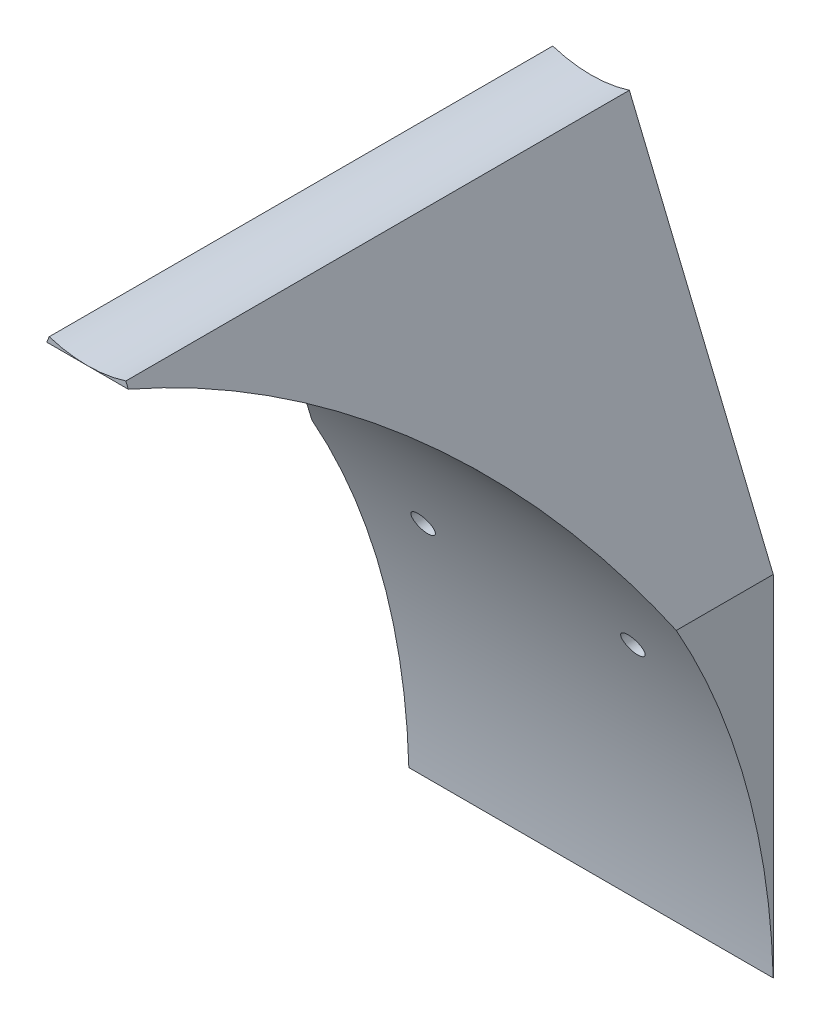
ISO-10303-21;
HEADER;
FILE_DESCRIPTION(('STEP AP214'),'2;1');
FILE_NAME('part.step','',(''),(''),'','','');
FILE_SCHEMA(('AUTOMOTIVE_DESIGN { 1 0 10303 214 1 1 1 1 }'));
ENDSEC;
DATA;
#1=APPLICATION_CONTEXT('core data for automotive mechanical design processes');
#2=APPLICATION_PROTOCOL_DEFINITION('international standard','automotive_design',2000,#1);
#3=PRODUCT_CONTEXT('',#1,'mechanical');
#4=PRODUCT('Part','Part','',(#3));
#5=PRODUCT_RELATED_PRODUCT_CATEGORY('part','',(#4));
#6=PRODUCT_DEFINITION_FORMATION('','',#4);
#7=PRODUCT_DEFINITION_CONTEXT('part definition',#1,'design');
#8=PRODUCT_DEFINITION('design','',#6,#7);
#9=PRODUCT_DEFINITION_SHAPE('','',#8);
#10=(LENGTH_UNIT() NAMED_UNIT(*) SI_UNIT(.MILLI.,.METRE.));
#11=(NAMED_UNIT(*) PLANE_ANGLE_UNIT() SI_UNIT($,.RADIAN.));
#12=(NAMED_UNIT(*) SI_UNIT($,.STERADIAN.) SOLID_ANGLE_UNIT());
#13=UNCERTAINTY_MEASURE_WITH_UNIT(LENGTH_MEASURE(1.E-05),#10,'distance_accuracy_value','');
#14=(GEOMETRIC_REPRESENTATION_CONTEXT(3) GLOBAL_UNCERTAINTY_ASSIGNED_CONTEXT((#13)) GLOBAL_UNIT_ASSIGNED_CONTEXT((#10,
#11,#12)) REPRESENTATION_CONTEXT('',''));
#15=CARTESIAN_POINT('',(0.,0.,0.));
#16=DIRECTION('',(0.,0.,1.));
#17=DIRECTION('',(1.,0.,0.));
#18=AXIS2_PLACEMENT_3D('',#15,#16,#17);
#19=CARTESIAN_POINT('',(0.,0.,76.2));
#20=DIRECTION('',(0.,0.,1.));
#21=DIRECTION('',(1.,0.,0.));
#22=AXIS2_PLACEMENT_3D('',#19,#20,#21);
#23=PLANE('',#22);
#24=CARTESIAN_POINT('',(0.,0.,76.2));
#25=DIRECTION('',(0.,0.,1.));
#26=DIRECTION('',(1.,0.,0.));
#27=AXIS2_PLACEMENT_3D('',#24,#25,#26);
#28=CIRCLE('',#27,19.05);
#29=CARTESIAN_POINT('',(0.,-19.05,76.2));
#30=VERTEX_POINT('',#29);
#31=CARTESIAN_POINT('',(-5.79810361486857,-18.1461977965426,76.2));
#32=VERTEX_POINT('',#31);
#33=EDGE_CURVE('E100',#30,#32,#28,.F.);
#34=ORIENTED_EDGE('',*,*,#33,.T.);
#35=DIRECTION('',(-0.382683432365091,-0.923879532511286,0.));
#36=VECTOR('',#35,1.);
#37=CARTESIAN_POINT('',(0.,-4.14833741348245,76.2));
#38=LINE('',#37,#36);
#39=CARTESIAN_POINT('',(-6.17247074524321,-19.05,76.2));
#40=VERTEX_POINT('',#39);
#41=EDGE_CURVE('E109',#32,#40,#38,.T.);
#42=ORIENTED_EDGE('',*,*,#41,.T.);
#43=DIRECTION('',(-1.,0.,0.));
#44=VECTOR('',#43,1.);
#45=CARTESIAN_POINT('',(156.950665084076,-19.05,76.2));
#46=LINE('',#45,#44);
#47=EDGE_CURVE('E185',#30,#40,#46,.T.);
#48=ORIENTED_EDGE('',*,*,#47,.F.);
#49=EDGE_LOOP('',(#34,#42,#48));
#50=FACE_BOUND('',#49,.T.);
#51=ADVANCED_FACE('F32',(#50),#23,.T.);
#52=CARTESIAN_POINT('',(27.5729775462199,-123.606903323708,76.2));
#53=DIRECTION('',(-1.,0.,0.));
#54=DIRECTION('',(0.,0.,1.));
#55=AXIS2_PLACEMENT_3D('',#52,#53,#54);
#56=PLANE('',#55);
#57=CARTESIAN_POINT('',(27.5729775462199,-126.829123794005,114.254572316563));
#58=DIRECTION('',(-1.,0.,0.));
#59=DIRECTION('',(0.,0.,1.));
#60=AXIS2_PLACEMENT_3D('',#57,#58,#59);
#61=CIRCLE('',#60,114.3);
#62=CARTESIAN_POINT('',(27.5729775462199,-70.7153937605752,14.6767670498506));
#63=VERTEX_POINT('',#62);
#64=CARTESIAN_POINT('',(27.5729775462199,-123.606903323708,0.));
#65=VERTEX_POINT('',#64);
#66=EDGE_CURVE('E189',#63,#65,#61,.T.);
#67=ORIENTED_EDGE('',*,*,#66,.T.);
#68=DIRECTION('',(0.,1.,0.));
#69=VECTOR('',#68,1.);
#70=CARTESIAN_POINT('',(27.5729775462199,-123.606903323708,0.));
#71=LINE('',#70,#69);
#72=CARTESIAN_POINT('',(27.5729775462199,-70.7153937605752,0.));
#73=VERTEX_POINT('',#72);
#74=EDGE_CURVE('E119',#65,#73,#71,.T.);
#75=ORIENTED_EDGE('',*,*,#74,.T.);
#76=DIRECTION('',(0.,0.,-1.));
#77=VECTOR('',#76,1.);
#78=CARTESIAN_POINT('',(27.5729775462199,-70.7153937605752,76.2));
#79=LINE('',#78,#77);
#80=EDGE_CURVE('E11',#63,#73,#79,.T.);
#81=ORIENTED_EDGE('',*,*,#80,.F.);
#82=EDGE_LOOP('',(#67,#75,#81));
#83=FACE_BOUND('',#82,.T.);
#84=ADVANCED_FACE('F34',(#83),#56,.F.);
#85=CARTESIAN_POINT('',(0.,-4.14833741348245,76.2));
#86=DIRECTION('',(-0.923879532511286,-0.382683432365091,0.));
#87=DIRECTION('',(0.382683432365091,-0.923879532511287,0.));
#88=AXIS2_PLACEMENT_3D('',#85,#86,#87);
#89=PLANE('',#88);
#90=DIRECTION('',(-0.382683432365091,0.923879532511287,0.));
#91=VECTOR('',#90,1.);
#92=CARTESIAN_POINT('',(0.,-4.14833741348245,0.));
#93=LINE('',#92,#91);
#94=CARTESIAN_POINT('',(5.79810361486859,-18.1461977965426,0.));
#95=VERTEX_POINT('',#94);
#96=EDGE_CURVE('E115',#73,#95,#93,.T.);
#97=ORIENTED_EDGE('',*,*,#96,.T.);
#98=DIRECTION('',(0.,0.,-1.));
#99=VECTOR('',#98,1.);
#100=CARTESIAN_POINT('',(5.79810361486859,-18.1461977965426,76.201));
#101=LINE('',#100,#99);
#102=CARTESIAN_POINT('',(5.79810361486859,-18.1461977965426,76.2));
#103=VERTEX_POINT('',#102);
#104=EDGE_CURVE('E54',#103,#95,#101,.T.);
#105=ORIENTED_EDGE('',*,*,#104,.F.);
#106=DIRECTION('',(-0.382683432365091,0.923879532511287,0.));
#107=VECTOR('',#106,1.);
#108=CARTESIAN_POINT('',(0.,-4.14833741348245,76.2));
#109=LINE('',#108,#107);
#110=CARTESIAN_POINT('',(6.17247074524344,-19.05,76.2));
#111=VERTEX_POINT('',#110);
#112=EDGE_CURVE('E117',#111,#103,#109,.T.);
#113=ORIENTED_EDGE('',*,*,#112,.F.);
#114=CARTESIAN_POINT('',(50.8160455614091,-126.829123794005,114.254572316563));
#115=DIRECTION('',(-0.923879532511286,-0.382683432365091,0.));
#116=DIRECTION('',(-0.382683432365091,0.923879532511287,0.));
#117=AXIS2_PLACEMENT_3D('',#114,#115,#116);
#118=ELLIPSE('',#117,123.717428493421,114.3);
#119=EDGE_CURVE('E188',#63,#111,#118,.F.);
#120=ORIENTED_EDGE('',*,*,#119,.F.);
#121=ORIENTED_EDGE('',*,*,#80,.T.);
#122=EDGE_LOOP('',(#97,#105,#113,#120,#121));
#123=FACE_BOUND('',#122,.T.);
#124=ADVANCED_FACE('F161',(#123),#89,.F.);
#125=CARTESIAN_POINT('',(-27.5729775462199,-70.7153937605752,76.2));
#126=DIRECTION('',(1.,0.,0.));
#127=DIRECTION('',(0.,1.,0.));
#128=AXIS2_PLACEMENT_3D('',#125,#126,#127);
#129=PLANE('',#128);
#130=CARTESIAN_POINT('',(-27.5729775462199,-126.829123794005,114.254572316563));
#131=DIRECTION('',(1.,0.,0.));
#132=DIRECTION('',(0.,1.,0.));
#133=AXIS2_PLACEMENT_3D('',#130,#131,#132);
#134=CIRCLE('',#133,114.3);
#135=CARTESIAN_POINT('',(-27.5729775462199,-123.606903323708,0.));
#136=VERTEX_POINT('',#135);
#137=CARTESIAN_POINT('',(-27.5729775462199,-70.7153937605753,14.6767670498506));
#138=VERTEX_POINT('',#137);
#139=EDGE_CURVE('E62',#136,#138,#134,.T.);
#140=ORIENTED_EDGE('',*,*,#139,.T.);
#141=DIRECTION('',(0.,0.,-1.));
#142=VECTOR('',#141,1.);
#143=CARTESIAN_POINT('',(-27.5729775462199,-70.7153937605752,76.2));
#144=LINE('',#143,#142);
#145=CARTESIAN_POINT('',(-27.5729775462199,-70.7153937605752,0.));
#146=VERTEX_POINT('',#145);
#147=EDGE_CURVE('E46',#138,#146,#144,.T.);
#148=ORIENTED_EDGE('',*,*,#147,.T.);
#149=DIRECTION('',(0.,-1.,0.));
#150=VECTOR('',#149,1.);
#151=CARTESIAN_POINT('',(-27.5729775462199,-70.7153937605752,0.));
#152=LINE('',#151,#150);
#153=EDGE_CURVE('E114',#146,#136,#152,.T.);
#154=ORIENTED_EDGE('',*,*,#153,.T.);
#155=EDGE_LOOP('',(#140,#148,#154));
#156=FACE_BOUND('',#155,.T.);
#157=ADVANCED_FACE('F165',(#156),#129,.F.);
#158=EDGE_CURVE('E177',#103,#30,#28,.F.);
#159=ORIENTED_EDGE('',*,*,#158,.T.);
#160=EDGE_CURVE('E180',#111,#30,#46,.T.);
#161=ORIENTED_EDGE('',*,*,#160,.F.);
#162=ORIENTED_EDGE('',*,*,#112,.T.);
#163=EDGE_LOOP('',(#159,#161,#162));
#164=FACE_BOUND('',#163,.T.);
#165=ADVANCED_FACE('F157',(#164),#23,.T.);
#166=CARTESIAN_POINT('',(0.,-4.14833741348245,76.2));
#167=DIRECTION('',(0.923879532511286,-0.382683432365091,0.));
#168=DIRECTION('',(0.382683432365091,0.923879532511287,0.));
#169=AXIS2_PLACEMENT_3D('',#166,#167,#168);
#170=PLANE('',#169);
#171=ORIENTED_EDGE('',*,*,#41,.F.);
#172=DIRECTION('',(0.,0.,-1.));
#173=VECTOR('',#172,1.);
#174=CARTESIAN_POINT('',(-5.79810361486857,-18.1461977965426,76.201));
#175=LINE('',#174,#173);
#176=CARTESIAN_POINT('',(-5.79810361486857,-18.1461977965426,0.));
#177=VERTEX_POINT('',#176);
#178=EDGE_CURVE('E94',#177,#32,#175,.F.);
#179=ORIENTED_EDGE('',*,*,#178,.F.);
#180=DIRECTION('',(-0.382683432365091,-0.923879532511286,0.));
#181=VECTOR('',#180,1.);
#182=CARTESIAN_POINT('',(0.,-4.14833741348245,0.));
#183=LINE('',#182,#181);
#184=EDGE_CURVE('E106',#177,#146,#183,.T.);
#185=ORIENTED_EDGE('',*,*,#184,.T.);
#186=ORIENTED_EDGE('',*,*,#147,.F.);
#187=CARTESIAN_POINT('',(-50.8160455614091,-126.829123794005,114.254572316563));
#188=DIRECTION('',(0.923879532511286,-0.382683432365091,0.));
#189=DIRECTION('',(-0.382683432365091,-0.923879532511287,0.));
#190=AXIS2_PLACEMENT_3D('',#187,#188,#189);
#191=ELLIPSE('',#190,123.717428493421,114.3);
#192=EDGE_CURVE('E191',#40,#138,#191,.F.);
#193=ORIENTED_EDGE('',*,*,#192,.F.);
#194=EDGE_LOOP('',(#171,#179,#185,#186,#193));
#195=FACE_BOUND('',#194,.T.);
#196=ADVANCED_FACE('F104',(#195),#170,.F.);
#197=CARTESIAN_POINT('',(0.,0.,0.));
#198=DIRECTION('',(0.,0.,1.));
#199=DIRECTION('',(1.,0.,0.));
#200=AXIS2_PLACEMENT_3D('',#197,#198,#199);
#201=PLANE('',#200);
#202=CARTESIAN_POINT('',(15.875,-81.009177720799,0.));
#203=DIRECTION('',(0.,0.,-1.));
#204=DIRECTION('',(-1.,0.,0.));
#205=AXIS2_PLACEMENT_3D('',#202,#203,#204);
#206=CIRCLE('',#205,1.69999999999999);
#207=CARTESIAN_POINT('',(14.175,-81.009177720799,0.));
#208=VERTEX_POINT('',#207);
#209=EDGE_CURVE('E182',#208,#208,#206,.T.);
#210=ORIENTED_EDGE('',*,*,#209,.F.);
#211=EDGE_LOOP('',(#210));
#212=FACE_BOUND('',#211,.T.);
#213=CARTESIAN_POINT('',(-15.875,-81.009177720799,0.));
#214=DIRECTION('',(0.,0.,-1.));
#215=DIRECTION('',(-1.,0.,0.));
#216=AXIS2_PLACEMENT_3D('',#213,#214,#215);
#217=CIRCLE('',#216,1.69999999999999);
#218=CARTESIAN_POINT('',(-17.575,-81.009177720799,0.));
#219=VERTEX_POINT('',#218);
#220=EDGE_CURVE('E208',#219,#219,#217,.T.);
#221=ORIENTED_EDGE('',*,*,#220,.F.);
#222=EDGE_LOOP('',(#221));
#223=FACE_BOUND('',#222,.T.);
#224=CARTESIAN_POINT('',(0.,-38.1,0.));
#225=DIRECTION('',(0.,0.,-1.));
#226=DIRECTION('',(-1.,0.,0.));
#227=AXIS2_PLACEMENT_3D('',#224,#225,#226);
#228=CIRCLE('',#227,1.69999999999999);
#229=CARTESIAN_POINT('',(-1.69999999999999,-38.1,0.));
#230=VERTEX_POINT('',#229);
#231=EDGE_CURVE('E130',#230,#230,#228,.T.);
#232=ORIENTED_EDGE('',*,*,#231,.F.);
#233=EDGE_LOOP('',(#232));
#234=FACE_BOUND('',#233,.T.);
#235=ORIENTED_EDGE('',*,*,#184,.F.);
#236=CARTESIAN_POINT('',(0.,0.,0.));
#237=DIRECTION('',(0.,0.,-1.));
#238=DIRECTION('',(-1.,0.,0.));
#239=AXIS2_PLACEMENT_3D('',#236,#237,#238);
#240=CIRCLE('',#239,19.05);
#241=EDGE_CURVE('E91',#95,#177,#240,.T.);
#242=ORIENTED_EDGE('',*,*,#241,.F.);
#243=ORIENTED_EDGE('',*,*,#96,.F.);
#244=ORIENTED_EDGE('',*,*,#74,.F.);
#245=DIRECTION('',(1.,0.,0.));
#246=VECTOR('',#245,1.);
#247=CARTESIAN_POINT('',(27.5729775462199,-123.606903323708,0.));
#248=LINE('',#247,#246);
#249=EDGE_CURVE('E197',#136,#65,#248,.T.);
#250=ORIENTED_EDGE('',*,*,#249,.F.);
#251=ORIENTED_EDGE('',*,*,#153,.F.);
#252=EDGE_LOOP('',(#235,#242,#243,#244,#250,#251));
#253=FACE_BOUND('',#252,.T.);
#254=ADVANCED_FACE('F112',(#212,#223,#234,#253),#201,.F.);
#255=CARTESIAN_POINT('',(156.950665084076,-126.829123794005,114.254572316563));
#256=DIRECTION('',(-1.,0.,0.));
#257=DIRECTION('',(0.,0.,1.));
#258=AXIS2_PLACEMENT_3D('',#255,#256,#257);
#259=CYLINDRICAL_SURFACE('',#258,114.3);
#260=CARTESIAN_POINT('',(14.175,-81.009177720799,9.54056875520341));
#261=CARTESIAN_POINT('',(14.17500341777,-81.1111232364903,9.49596047763787));
#262=CARTESIAN_POINT('',(14.1841877442733,-81.2132130328524,9.45146776926868));
#263=CARTESIAN_POINT('',(14.2209214433864,-81.4148189571711,9.36394818255781));
#264=CARTESIAN_POINT('',(14.2484950657741,-81.5143315062958,9.32092331870085));
#265=CARTESIAN_POINT('',(14.3217796113821,-81.7079121701816,9.23753854218429));
#266=CARTESIAN_POINT('',(14.3675217967638,-81.8019705787777,9.19718336353718));
#267=CARTESIAN_POINT('',(14.4764072461999,-81.9812507505376,9.12052553779641));
#268=CARTESIAN_POINT('',(14.5395417926361,-82.0664769113374,9.08422087322798));
#269=CARTESIAN_POINT('',(14.6783039124233,-82.2208480966336,9.01865433384659));
#270=CARTESIAN_POINT('',(14.7531478090435,-82.2905845899803,8.98913086565774));
#271=CARTESIAN_POINT('',(14.9154922884799,-82.4162538762285,8.9360475799659));
#272=CARTESIAN_POINT('',(15.0029861447307,-82.4721939628048,8.9124846111866));
#273=CARTESIAN_POINT('',(15.1802853990547,-82.5636828792282,8.87400955585863));
#274=CARTESIAN_POINT('',(15.2692960895275,-82.6005388810233,8.85854174197356));
#275=CARTESIAN_POINT('',(15.4530767029442,-82.6588013391722,8.83411118282305));
#276=CARTESIAN_POINT('',(15.5478437605507,-82.6802154147971,8.82514522943263));
#277=CARTESIAN_POINT('',(15.733461197648,-82.7056862570822,8.81448300129962));
#278=CARTESIAN_POINT('',(15.8241383673938,-82.7108264572703,8.81233294426671));
#279=CARTESIAN_POINT('',(16.0050854455065,-82.7066058574306,8.81409897883869));
#280=CARTESIAN_POINT('',(16.0953554295067,-82.6972478718612,8.81801389308178));
#281=CARTESIAN_POINT('',(16.2706696907243,-82.6648356661595,8.83158645844805));
#282=CARTESIAN_POINT('',(16.3557874875993,-82.6421171197257,8.84110336903021));
#283=CARTESIAN_POINT('',(16.5208321835167,-82.5841547978665,8.86541870203811));
#284=CARTESIAN_POINT('',(16.6007587269826,-82.548910165531,8.88021748579743));
#285=CARTESIAN_POINT('',(16.7554517509763,-82.4661255822225,8.91504294539711));
#286=CARTESIAN_POINT('',(16.8300336310972,-82.4182938305518,8.93519381574384));
#287=CARTESIAN_POINT('',(16.9700805227635,-82.3124465319258,8.97988998314318));
#288=CARTESIAN_POINT('',(17.0355433188133,-82.2544285179142,9.00443634478824));
#289=CARTESIAN_POINT('',(17.159952571139,-82.1260402955208,9.05889998172447));
#290=CARTESIAN_POINT('',(17.2182264396478,-82.055121410491,9.08905854435049));
#291=CARTESIAN_POINT('',(17.322117711732,-81.9059073237767,9.15271123022568));
#292=CARTESIAN_POINT('',(17.3677308768186,-81.8276096635841,9.18620646542261));
#293=CARTESIAN_POINT('',(17.4487505633545,-81.6593304734949,9.25843531635809));
#294=CARTESIAN_POINT('',(17.4830723605958,-81.5689143360159,9.29737373546371));
#295=CARTESIAN_POINT('',(17.5358592848855,-81.3843667189279,9.37714781023711));
#296=CARTESIAN_POINT('',(17.5543189431798,-81.2902339696409,9.41798411512404));
#297=CARTESIAN_POINT('',(17.5759121089078,-81.0942876385403,9.50331022394381));
#298=CARTESIAN_POINT('',(17.5779467999171,-80.9923790152013,9.5478625972558));
#299=CARTESIAN_POINT('',(17.5638359837172,-80.7897359749175,9.6368060210967));
#300=CARTESIAN_POINT('',(17.5476859499266,-80.6890018566407,9.68119702869813));
#301=CARTESIAN_POINT('',(17.4968046179152,-80.4889140701456,9.769706285821));
#302=CARTESIAN_POINT('',(17.4616078949187,-80.3896618795641,9.81378841353049));
#303=CARTESIAN_POINT('',(17.3728805922451,-80.1983331972867,9.89907249426562));
#304=CARTESIAN_POINT('',(17.3193510275846,-80.1062563086692,9.94027460659426));
#305=CARTESIAN_POINT('',(17.1969901084779,-79.9353924619176,10.0169761611299));
#306=CARTESIAN_POINT('',(17.1287250628859,-79.8562660404237,10.0526194051143));
#307=CARTESIAN_POINT('',(16.977405889034,-79.7108352412683,10.1182997705639));
#308=CARTESIAN_POINT('',(16.8943600758591,-79.6445236979768,10.1483400246947));
#309=CARTESIAN_POINT('',(16.7231415263281,-79.5326146450607,10.1991366180238));
#310=CARTESIAN_POINT('',(16.6359596256867,-79.4857581956819,10.2204550230902));
#311=CARTESIAN_POINT('',(16.4535629433487,-79.4075885558519,10.2560633960598));
#312=CARTESIAN_POINT('',(16.3583537844254,-79.3762645896262,10.2703582365496));
#313=CARTESIAN_POINT('',(16.171906412506,-79.3328199999447,10.2901955121274));
#314=CARTESIAN_POINT('',(16.0810810320712,-79.3192258065126,10.2964094168859));
#315=CARTESIAN_POINT('',(15.8982281668057,-79.3068711990166,10.3020564243114));
#316=CARTESIAN_POINT('',(15.8062011002626,-79.3081057539159,10.3014918267606));
#317=CARTESIAN_POINT('',(15.6282211931841,-79.3249241175205,10.2938052660961));
#318=CARTESIAN_POINT('',(15.5421882436024,-79.3398193607997,10.2869979666759));
#319=CARTESIAN_POINT('',(15.3740306992118,-79.3823550862617,10.2675794730467));
#320=CARTESIAN_POINT('',(15.2919061812755,-79.4099958190135,10.2549681647342));
#321=CARTESIAN_POINT('',(15.1324194494541,-79.4774509276212,10.2242379789234));
#322=CARTESIAN_POINT('',(15.055149265658,-79.5174449999609,10.2060378284155));
#323=CARTESIAN_POINT('',(14.9084859424241,-79.6080051835267,10.1649070073612));
#324=CARTESIAN_POINT('',(14.8390943711653,-79.658573393784,10.1419753976031));
#325=CARTESIAN_POINT('',(14.7052087761465,-79.7723252456396,10.0905101383526));
#326=CARTESIAN_POINT('',(14.6413392552206,-79.8361208054785,10.0617068286097));
#327=CARTESIAN_POINT('',(14.5251067504387,-79.9719747491773,10.0005405781121));
#328=CARTESIAN_POINT('',(14.472750823721,-80.0440381597848,9.96817547232375));
#329=CARTESIAN_POINT('',(14.3762387896034,-80.2011283321843,9.8978376393091));
#330=CARTESIAN_POINT('',(14.3332091034913,-80.286737799972,9.85962207372441));
#331=CARTESIAN_POINT('',(14.2623066888934,-80.4630635857411,9.78118933412986));
#332=CARTESIAN_POINT('',(14.2344220554186,-80.5537758305256,9.74097375948095));
#333=CARTESIAN_POINT('',(14.2012026641401,-80.705624992064,9.67389943216382));
#334=CARTESIAN_POINT('',(14.191386226352,-80.7659428632774,9.64731756560533));
#335=CARTESIAN_POINT('',(14.1782837117243,-80.887215819627,9.59399959381704));
#336=CARTESIAN_POINT('',(14.1749979547197,-80.9481709358249,9.56726348109747));
#337=CARTESIAN_POINT('',(14.175,-81.009177720799,9.54056875520341));
#338=B_SPLINE_CURVE_WITH_KNOTS('',3,(#260,#261,#262,#263,#264,#265,#266,#267,#268,#269,#270,
#271,#272,#273,#274,#275,#276,#277,#278,#279,#280,#281,#282,#283,#284,#285,#286,#287,#288,#289,
#290,#291,#292,#293,#294,#295,#296,#297,#298,#299,#300,#301,#302,#303,#304,#305,#306,#307,#308,
#309,#310,#311,#312,#313,#314,#315,#316,#317,#318,#319,#320,#321,#322,#323,#324,#325,#326,#327,
#328,#329,#330,#331,#332,#333,#334,#335,#336,#337),.UNSPECIFIED.,.T.,.F.,(4,2,2,2,2,2,2,2,2,2,2,
2,2,2,2,2,2,2,2,2,2,2,2,2,2,2,2,2,2,2,2,2,2,2,2,2,2,2,4),(0.,0.33359961170578,0.667640009976157,
1.0022576900404,1.33670795302844,1.65441456210597,1.97195284909492,2.26313348821217,
2.55417035607061,2.82537328438533,3.09652357206167,3.36113608591446,3.62576670541256,
3.89717536165878,4.16864984248618,4.45726831050995,4.74598328460307,5.05740264735505,
5.36892933443216,5.70113740007296,6.03342817795368,6.37423174790914,6.71501645197103,
7.04449999108293,7.3737987580815,7.67588434080796,7.97776005519505,8.25248935555488,
8.52712544952343,8.78863677935517,9.05015325056787,9.31566884984794,9.58123720571969,
9.86431408025897,10.1475639831981,10.4557300018084,10.7636534301533,10.9632781316276,
11.1629126093265),.UNSPECIFIED.);
#339=CARTESIAN_POINT('',(14.175,-81.009177720799,9.54056875520341));
#340=VERTEX_POINT('',#339);
#341=EDGE_CURVE('E36',#340,#340,#338,.T.);
#342=ORIENTED_EDGE('',*,*,#341,.F.);
#343=EDGE_LOOP('',(#342));
#344=FACE_BOUND('',#343,.T.);
#345=CARTESIAN_POINT('',(-17.575,-81.009177720799,9.54056875520341));
#346=CARTESIAN_POINT('',(-17.57499658223,-81.1111232364903,9.49596047763787));
#347=CARTESIAN_POINT('',(-17.5658122557267,-81.2132130328524,9.45146776926868));
#348=CARTESIAN_POINT('',(-17.5290785566136,-81.4148189571711,9.36394818255782));
#349=CARTESIAN_POINT('',(-17.5015049342259,-81.5143315062958,9.32092331870085));
#350=CARTESIAN_POINT('',(-17.4282203886179,-81.7079121701816,9.23753854218429));
#351=CARTESIAN_POINT('',(-17.3824782032363,-81.8019705787778,9.19718336353718));
#352=CARTESIAN_POINT('',(-17.2735927538001,-81.9812507505376,9.12052553779641));
#353=CARTESIAN_POINT('',(-17.2104582073639,-82.0664769113374,9.08422087322799));
#354=CARTESIAN_POINT('',(-17.0716960875767,-82.2208480966336,9.01865433384659));
#355=CARTESIAN_POINT('',(-16.9968521909565,-82.2905845899803,8.98913086565774));
#356=CARTESIAN_POINT('',(-16.8345077115201,-82.4162538762285,8.93604757996589));
#357=CARTESIAN_POINT('',(-16.7470138552693,-82.4721939628049,8.91248461118659));
#358=CARTESIAN_POINT('',(-16.5697146009453,-82.5636828792282,8.87400955585863));
#359=CARTESIAN_POINT('',(-16.4807039104724,-82.6005388810233,8.85854174197356));
#360=CARTESIAN_POINT('',(-16.2969232970558,-82.6588013391722,8.83411118282306));
#361=CARTESIAN_POINT('',(-16.2021562394493,-82.6802154147971,8.82514522943264));
#362=CARTESIAN_POINT('',(-16.016538802352,-82.7056862570822,8.81448300129963));
#363=CARTESIAN_POINT('',(-15.9258616326062,-82.7108264572703,8.81233294426672));
#364=CARTESIAN_POINT('',(-15.7449145544935,-82.7066058574306,8.8140989788387));
#365=CARTESIAN_POINT('',(-15.6546445704933,-82.6972478718612,8.81801389308179));
#366=CARTESIAN_POINT('',(-15.4793303092757,-82.6648356661595,8.83158645844806));
#367=CARTESIAN_POINT('',(-15.3942125124007,-82.6421171197257,8.84110336903022));
#368=CARTESIAN_POINT('',(-15.2291678164833,-82.5841547978665,8.86541870203811));
#369=CARTESIAN_POINT('',(-15.1492412730174,-82.548910165531,8.88021748579743));
#370=CARTESIAN_POINT('',(-14.9945482490237,-82.4661255822225,8.91504294539712));
#371=CARTESIAN_POINT('',(-14.9199663689028,-82.4182938305518,8.93519381574385));
#372=CARTESIAN_POINT('',(-14.7799194772365,-82.3124465319258,8.97988998314319));
#373=CARTESIAN_POINT('',(-14.7144566811867,-82.2544285179142,9.00443634478823));
#374=CARTESIAN_POINT('',(-14.5900474288609,-82.1260402955208,9.05889998172446));
#375=CARTESIAN_POINT('',(-14.5317735603522,-82.055121410491,9.08905854435048));
#376=CARTESIAN_POINT('',(-14.427882288268,-81.9059073237767,9.15271123022568));
#377=CARTESIAN_POINT('',(-14.3822691231814,-81.8276096635841,9.18620646542262));
#378=CARTESIAN_POINT('',(-14.3012494366455,-81.659330473495,9.2584353163581));
#379=CARTESIAN_POINT('',(-14.2669276394042,-81.5689143360159,9.29737373546372));
#380=CARTESIAN_POINT('',(-14.2141407151146,-81.3843667189279,9.37714781023712));
#381=CARTESIAN_POINT('',(-14.1956810568202,-81.2902339696409,9.41798411512405));
#382=CARTESIAN_POINT('',(-14.1740878910922,-81.0942876385403,9.50331022394382));
#383=CARTESIAN_POINT('',(-14.1720532000829,-80.9923790152013,9.5478625972558));
#384=CARTESIAN_POINT('',(-14.1861640162828,-80.7897359749175,9.63680602109671));
#385=CARTESIAN_POINT('',(-14.2023140500734,-80.6890018566407,9.68119702869814));
#386=CARTESIAN_POINT('',(-14.2531953820848,-80.4889140701456,9.769706285821));
#387=CARTESIAN_POINT('',(-14.2883921050813,-80.389661879564,9.81378841353048));
#388=CARTESIAN_POINT('',(-14.3771194077549,-80.1983331972867,9.89907249426561));
#389=CARTESIAN_POINT('',(-14.4306489724153,-80.1062563086692,9.94027460659426));
#390=CARTESIAN_POINT('',(-14.5530098915222,-79.9353924619176,10.0169761611299));
#391=CARTESIAN_POINT('',(-14.6212749371141,-79.8562660404237,10.0526194051143));
#392=CARTESIAN_POINT('',(-14.772594110966,-79.7108352412683,10.1182997705639));
#393=CARTESIAN_POINT('',(-14.8556399241409,-79.6445236979768,10.1483400246947));
#394=CARTESIAN_POINT('',(-15.0268584736719,-79.5326146450607,10.1991366180238));
#395=CARTESIAN_POINT('',(-15.1140403743133,-79.4857581956819,10.2204550230902));
#396=CARTESIAN_POINT('',(-15.2964370566513,-79.4075885558519,10.2560633960598));
#397=CARTESIAN_POINT('',(-15.3916462155746,-79.3762645896262,10.2703582365496));
#398=CARTESIAN_POINT('',(-15.578093587494,-79.3328199999447,10.2901955121274));
#399=CARTESIAN_POINT('',(-15.6689189679288,-79.3192258065126,10.2964094168859));
#400=CARTESIAN_POINT('',(-15.8517718331943,-79.3068711990166,10.3020564243114));
#401=CARTESIAN_POINT('',(-15.9437988997374,-79.3081057539159,10.3014918267606));
#402=CARTESIAN_POINT('',(-16.1217788068159,-79.3249241175205,10.2938052660961));
#403=CARTESIAN_POINT('',(-16.2078117563976,-79.3398193607997,10.2869979666759));
#404=CARTESIAN_POINT('',(-16.3759693007882,-79.3823550862617,10.2675794730467));
#405=CARTESIAN_POINT('',(-16.4580938187245,-79.4099958190135,10.2549681647342));
#406=CARTESIAN_POINT('',(-16.6175805505459,-79.4774509276212,10.2242379789234));
#407=CARTESIAN_POINT('',(-16.694850734342,-79.5174449999609,10.2060378284155));
#408=CARTESIAN_POINT('',(-16.8415140575759,-79.6080051835267,10.1649070073612));
#409=CARTESIAN_POINT('',(-16.9109056288347,-79.658573393784,10.1419753976031));
#410=CARTESIAN_POINT('',(-17.0447912238535,-79.7723252456396,10.0905101383526));
#411=CARTESIAN_POINT('',(-17.1086607447794,-79.8361208054785,10.0617068286097));
#412=CARTESIAN_POINT('',(-17.2248932495613,-79.9719747491773,10.0005405781121));
#413=CARTESIAN_POINT('',(-17.277249176279,-80.0440381597848,9.96817547232376));
#414=CARTESIAN_POINT('',(-17.3737612103966,-80.2011283321843,9.8978376393091));
#415=CARTESIAN_POINT('',(-17.4167908965087,-80.286737799972,9.85962207372441));
#416=CARTESIAN_POINT('',(-17.4876933111066,-80.4630635857411,9.78118933412986));
#417=CARTESIAN_POINT('',(-17.5155779445814,-80.5537758305257,9.74097375948095));
#418=CARTESIAN_POINT('',(-17.5487973358599,-80.705624992064,9.67389943216383));
#419=CARTESIAN_POINT('',(-17.558613773648,-80.7659428632774,9.64731756560533));
#420=CARTESIAN_POINT('',(-17.5717162882757,-80.887215819627,9.59399959381704));
#421=CARTESIAN_POINT('',(-17.5750020452803,-80.9481709358249,9.56726348109747));
#422=CARTESIAN_POINT('',(-17.575,-81.009177720799,9.54056875520341));
#423=B_SPLINE_CURVE_WITH_KNOTS('',3,(#345,#346,#347,#348,#349,#350,#351,#352,#353,#354,#355,
#356,#357,#358,#359,#360,#361,#362,#363,#364,#365,#366,#367,#368,#369,#370,#371,#372,#373,#374,
#375,#376,#377,#378,#379,#380,#381,#382,#383,#384,#385,#386,#387,#388,#389,#390,#391,#392,#393,
#394,#395,#396,#397,#398,#399,#400,#401,#402,#403,#404,#405,#406,#407,#408,#409,#410,#411,#412,
#413,#414,#415,#416,#417,#418,#419,#420,#421,#422),.UNSPECIFIED.,.T.,.F.,(4,2,2,2,2,2,2,2,2,2,2,
2,2,2,2,2,2,2,2,2,2,2,2,2,2,2,2,2,2,2,2,2,2,2,2,2,2,2,4),(0.,0.333599611705793,
0.667640009976158,1.00225769004039,1.33670795302843,1.65441456210597,1.97195284909493,
2.26313348821217,2.5541703560706,2.82537328438533,3.09652357206168,3.36113608591446,
3.62576670541256,3.89717536165879,4.16864984248618,4.45726831050995,4.74598328460306,
5.05740264735504,5.36892933443217,5.70113740007296,6.03342817795369,6.37423174790915,
6.71501645197104,7.04449999108293,7.3737987580815,7.67588434080796,7.97776005519505,
8.25248935555488,8.52712544952344,8.78863677935518,9.05015325056787,9.31566884984794,
9.5812372057197,9.86431408025898,10.1475639831981,10.4557300018085,10.7636534301533,
10.9632781316276,11.1629126093265),.UNSPECIFIED.);
#424=CARTESIAN_POINT('',(-17.575,-81.009177720799,9.54056875520341));
#425=VERTEX_POINT('',#424);
#426=EDGE_CURVE('E131',#425,#425,#423,.T.);
#427=ORIENTED_EDGE('',*,*,#426,.F.);
#428=EDGE_LOOP('',(#427));
#429=FACE_BOUND('',#428,.T.);
#430=CARTESIAN_POINT('',(-1.69999999999999,-38.1,42.2015877097607));
#431=CARTESIAN_POINT('',(-1.70000068512579,-38.1725120229444,42.1122933829297));
#432=CARTESIAN_POINT('',(-1.6953691778932,-38.2451679713723,42.0230977742016));
#433=CARTESIAN_POINT('',(-1.67662753483154,-38.3903066799801,41.8454652027898));
#434=CARTESIAN_POINT('',(-1.66251133645347,-38.4627892996122,41.7570287620012));
#435=CARTESIAN_POINT('',(-1.62435752967168,-38.6069768012551,41.5816360685612));
#436=CARTESIAN_POINT('',(-1.60031938255921,-38.6786816408196,41.4946798965474));
#437=CARTESIAN_POINT('',(-1.5416658806177,-38.8205214266111,41.3231779908987));
#438=CARTESIAN_POINT('',(-1.50705964793162,-38.8906576709986,41.2386302469036));
#439=CARTESIAN_POINT('',(-1.42269214211195,-39.0346270048061,41.0655697478607));
#440=CARTESIAN_POINT('',(-1.37185015024452,-39.1082276204822,40.9773813052284));
#441=CARTESIAN_POINT('',(-1.25491086738494,-39.2505050170467,40.8073956914067));
#442=CARTESIAN_POINT('',(-1.18883894940988,-39.319189741112,40.7255881896552));
#443=CARTESIAN_POINT('',(-1.0570661218765,-39.4335431828344,40.589733637748));
#444=CARTESIAN_POINT('',(-0.994886201898809,-39.4808397364126,40.5336666448258));
#445=CARTESIAN_POINT('',(-0.859825787869947,-39.5687292658024,40.4296567577754));
#446=CARTESIAN_POINT('',(-0.786962015999303,-39.6093325106463,40.3817014155534));
#447=CARTESIAN_POINT('',(-0.650362620217678,-39.6719932293155,40.3077919232906));
#448=CARTESIAN_POINT('',(-0.588952873487113,-39.6961458363969,40.2793387526673));
#449=CARTESIAN_POINT('',(-0.460864419120325,-39.737719292261,40.2303985956543));
#450=CARTESIAN_POINT('',(-0.394189924003771,-39.7551454586718,40.209905316444));
#451=CARTESIAN_POINT('',(-0.256433966731036,-39.7820223158995,40.1783104617907));
#452=CARTESIAN_POINT('',(-0.1853204872938,-39.7914055279691,40.1672883456053));
#453=CARTESIAN_POINT('',(-0.0416392284613272,-39.8010109120507,40.1560053191708));
#454=CARTESIAN_POINT('',(0.0309275938692155,-39.8012389266153,40.155737545846));
#455=CARTESIAN_POINT('',(0.165662028155275,-39.7930843422958,40.1653162877418));
#456=CARTESIAN_POINT('',(0.227992918649895,-39.7857775531169,40.1738991232147));
#457=CARTESIAN_POINT('',(0.349992937666958,-39.7647346992334,40.1986312098322));
#458=CARTESIAN_POINT('',(0.409661072213186,-39.7509962552946,40.2147832610262));
#459=CARTESIAN_POINT('',(0.541142801082371,-39.7133944445812,40.2590268486279));
#460=CARTESIAN_POINT('',(0.611757253460336,-39.6877824060872,40.2891841560864));
#461=CARTESIAN_POINT('',(0.745602914622542,-39.6295198661806,40.3578801912587));
#462=CARTESIAN_POINT('',(0.808820853696982,-39.5968570050053,40.3964336380774));
#463=CARTESIAN_POINT('',(0.952200251385317,-39.511686117323,40.497125250223));
#464=CARTESIAN_POINT('',(1.02856303393335,-39.4565560077576,40.5624247567129));
#465=CARTESIAN_POINT('',(1.167011585349,-39.3394894840951,40.7014473605869));
#466=CARTESIAN_POINT('',(1.22906943208109,-39.277540101606,40.7751865188394));
#467=CARTESIAN_POINT('',(1.32675546358906,-39.1648218922899,40.9097298422936));
#468=CARTESIAN_POINT('',(1.36514514516483,-39.1149760294726,40.9693450232787));
#469=CARTESIAN_POINT('',(1.43505672291919,-39.013461031432,41.0910180637492));
#470=CARTESIAN_POINT('',(1.46657524226332,-38.9617910141558,41.1530771066628));
#471=CARTESIAN_POINT('',(1.55162644893486,-38.8047457772291,41.342120717054));
#472=CARTESIAN_POINT('',(1.59558948978239,-38.6974144092576,41.4718775088993));
#473=CARTESIAN_POINT('',(1.6500544735952,-38.5160774688845,41.6921222080758));
#474=CARTESIAN_POINT('',(1.66679065476783,-38.4426002628771,41.7816392676498));
#475=CARTESIAN_POINT('',(1.69039956901272,-38.2952415373335,41.9617289683764));
#476=CARTESIAN_POINT('',(1.69726848222125,-38.2213598723254,42.0523020046524));
#477=CARTESIAN_POINT('',(1.70140137408518,-38.0737359249078,42.2338472814631));
#478=CARTESIAN_POINT('',(1.69865967543492,-37.9999937506409,42.3248197262432));
#479=CARTESIAN_POINT('',(1.68360569906507,-37.853190827398,42.5064923507549));
#480=CARTESIAN_POINT('',(1.67129635123667,-37.7801298767418,42.5971926053049));
#481=CARTESIAN_POINT('',(1.64005333693511,-37.6484115961619,42.7612192324284));
#482=CARTESIAN_POINT('',(1.62273680492117,-37.5895570276131,42.8346979727612));
#483=CARTESIAN_POINT('',(1.58134558547501,-37.4729650448799,42.9806246932314));
#484=CARTESIAN_POINT('',(1.5572721861177,-37.4152274200106,43.0530728670646));
#485=CARTESIAN_POINT('',(1.50206041423942,-37.3013697173463,43.1962892059749));
#486=CARTESIAN_POINT('',(1.47093678041134,-37.2452465365037,43.2670605403645));
#487=CARTESIAN_POINT('',(1.40110574020139,-37.135035968276,43.4063649116626));
#488=CARTESIAN_POINT('',(1.36240267766616,-37.0809474358807,43.4748992045174));
#489=CARTESIAN_POINT('',(1.26946580260853,-36.9665183318814,43.620217634162));
#490=CARTESIAN_POINT('',(1.21371187668627,-36.9066700178883,43.696433590465));
#491=CARTESIAN_POINT('',(1.08954525030174,-36.7923288559159,43.842399266333));
#492=CARTESIAN_POINT('',(1.0211456028274,-36.7378305736098,43.912155543185));
#493=CARTESIAN_POINT('',(0.888750582024288,-36.6492008031295,44.0258363105532));
#494=CARTESIAN_POINT('',(0.827772447951534,-36.6133486670913,44.0719051594482));
#495=CARTESIAN_POINT('',(0.697444782373635,-36.5479489016878,44.1560538720901));
#496=CARTESIAN_POINT('',(0.628109454610906,-36.518390805239,44.1941469977917));
#497=CARTESIAN_POINT('',(0.498633379303222,-36.4736851366861,44.2518172214576));
#498=CARTESIAN_POINT('',(0.440109218401136,-36.4567847372884,44.2736403413915));
#499=CARTESIAN_POINT('',(0.319301746011222,-36.4291098016702,44.3093938866045));
#500=CARTESIAN_POINT('',(0.257021881786599,-36.4183297396445,44.3233314314108));
#501=CARTESIAN_POINT('',(0.129871335676024,-36.4037546712464,44.3421787828413));
#502=CARTESIAN_POINT('',(0.0649870062416206,-36.4000033025443,44.3470321903728));
#503=CARTESIAN_POINT('',(-0.0647817826241752,-36.3999967035976,44.3470407160169));
#504=CARTESIAN_POINT('',(-0.129666241487049,-36.4037407791728,44.3421967322399));
#505=CARTESIAN_POINT('',(-0.251358265797256,-36.4176718063741,44.3241822336265));
#506=CARTESIAN_POINT('',(-0.308361668642356,-36.4272379458845,44.3118140772618));
#507=CARTESIAN_POINT('',(-0.419319424318698,-36.451545374747,44.2804077080586));
#508=CARTESIAN_POINT('',(-0.473272466855514,-36.4662888687356,44.2613666537537));
#509=CARTESIAN_POINT('',(-0.599813000428904,-36.507406558587,44.2083094657847));
#510=CARTESIAN_POINT('',(-0.670434721278968,-36.5360557834238,44.1713748735101));
#511=CARTESIAN_POINT('',(-0.803312489489531,-36.5999485783395,44.08913446987));
#512=CARTESIAN_POINT('',(-0.865549138646361,-36.6352070028603,44.0438098043993));
#513=CARTESIAN_POINT('',(-1.01133873818129,-36.7295628784194,43.9227334232964));
#514=CARTESIAN_POINT('',(-1.08974673520699,-36.7916965367194,43.8431889505122));
#515=CARTESIAN_POINT('',(-1.23027142679811,-36.9228425754836,43.6758078695251));
#516=CARTESIAN_POINT('',(-1.29234592979138,-36.9918721472661,43.5879505679924));
#517=CARTESIAN_POINT('',(-1.38973681528993,-37.1184276445802,43.4273952958145));
#518=CARTESIAN_POINT('',(-1.4279324556827,-37.175068414116,43.3557079007272));
#519=CARTESIAN_POINT('',(-1.49633586210494,-37.2903841491227,43.2101304048045));
#520=CARTESIAN_POINT('',(-1.52653878615413,-37.3490603234089,43.1362389988001));
#521=CARTESIAN_POINT('',(-1.57941633961271,-37.4678117843185,42.9870832490895));
#522=CARTESIAN_POINT('',(-1.602099865168,-37.5278853269831,42.9118206397141));
#523=CARTESIAN_POINT('',(-1.64034496443751,-37.6491036627862,42.7603528368242));
#524=CARTESIAN_POINT('',(-1.6559059566273,-37.7102485429719,42.6841475668669));
#525=CARTESIAN_POINT('',(-1.67868892550538,-37.8260258849923,42.5402358037364));
#526=CARTESIAN_POINT('',(-1.6866766428195,-37.8805781217458,42.4725843137087));
#527=CARTESIAN_POINT('',(-1.69733284791762,-37.9900592098855,42.3371322087664));
#528=CARTESIAN_POINT('',(-1.69999948022393,-38.0449881859444,42.2693315500838));
#529=CARTESIAN_POINT('',(-1.69999999999999,-38.1,42.2015877097607));
#530=B_SPLINE_CURVE_WITH_KNOTS('',3,(#430,#431,#432,#433,#434,#435,#436,#437,#438,#439,#440,
#441,#442,#443,#444,#445,#446,#447,#448,#449,#450,#451,#452,#453,#454,#455,#456,#457,#458,#459,
#460,#461,#462,#463,#464,#465,#466,#467,#468,#469,#470,#471,#472,#473,#474,#475,#476,#477,#478,
#479,#480,#481,#482,#483,#484,#485,#486,#487,#488,#489,#490,#491,#492,#493,#494,#495,#496,#497,
#498,#499,#500,#501,#502,#503,#504,#505,#506,#507,#508,#509,#510,#511,#512,#513,#514,#515,#516,
#517,#518,#519,#520,#521,#522,#523,#524,#525,#526,#527,#528,#529),.UNSPECIFIED.,.T.,.F.,(4,2,2,
2,2,2,2,2,2,2,2,2,2,2,2,2,2,2,2,2,2,2,2,2,2,2,2,2,2,2,2,2,2,2,2,2,2,2,2,2,2,2,2,2,2,2,2,2,2,4),
(0.,0.345011349511473,0.69024343795116,1.03549427311296,1.38044793356022,1.75633454858852,
2.13159940662452,2.41917555786195,2.70630631180686,2.92109021487278,3.13570396976258,
3.35210114319772,3.56836021671941,3.75750990023685,3.94672961043224,4.18822860281916,
4.43015442009851,4.77208695330443,5.11468136516915,5.37435599931002,5.63415796435744,
6.15417491054154,6.50486762987823,6.85569607449634,7.2067317999744,7.55766007048225,
7.84460018964921,8.13148564596517,8.41777680707309,8.70390436949283,9.03848319050001,
9.37271856614257,9.62517430777761,9.87720687488405,10.0705728260152,10.2637639160816,
10.4581505096023,10.6525191011112,10.8291045311447,11.0057652466773,11.2584070262836,
11.5116235887666,11.8929445084096,12.2752409696001,12.5719356112621,12.868809580933,
13.1653310570833,13.4618767386294,13.723531077065,13.9852766391902),.UNSPECIFIED.);
#531=CARTESIAN_POINT('',(-1.69999999999999,-38.1,42.2015877097607));
#532=VERTEX_POINT('',#531);
#533=EDGE_CURVE('E124',#532,#532,#530,.T.);
#534=ORIENTED_EDGE('',*,*,#533,.F.);
#535=EDGE_LOOP('',(#534));
#536=FACE_BOUND('',#535,.T.);
#537=ORIENTED_EDGE('',*,*,#119,.T.);
#538=ORIENTED_EDGE('',*,*,#160,.T.);
#539=ORIENTED_EDGE('',*,*,#47,.T.);
#540=ORIENTED_EDGE('',*,*,#192,.T.);
#541=ORIENTED_EDGE('',*,*,#139,.F.);
#542=ORIENTED_EDGE('',*,*,#249,.T.);
#543=ORIENTED_EDGE('',*,*,#66,.F.);
#544=EDGE_LOOP('',(#537,#538,#539,#540,#541,#542,#543));
#545=FACE_BOUND('',#544,.T.);
#546=ADVANCED_FACE('F136',(#344,#429,#536,#545),#259,.F.);
#547=CARTESIAN_POINT('',(0.,-38.1,0.));
#548=DIRECTION('',(0.,0.,-1.));
#549=DIRECTION('',(-1.,0.,0.));
#550=AXIS2_PLACEMENT_3D('',#547,#548,#549);
#551=CYLINDRICAL_SURFACE('',#550,1.69999999999999);
#552=ORIENTED_EDGE('',*,*,#533,.T.);
#553=EDGE_LOOP('',(#552));
#554=FACE_BOUND('',#553,.T.);
#555=ORIENTED_EDGE('',*,*,#231,.T.);
#556=EDGE_LOOP('',(#555));
#557=FACE_BOUND('',#556,.T.);
#558=ADVANCED_FACE('F139',(#554,#557),#551,.F.);
#559=CARTESIAN_POINT('',(-15.875,-81.009177720799,0.));
#560=DIRECTION('',(0.,0.,-1.));
#561=DIRECTION('',(-1.,0.,0.));
#562=AXIS2_PLACEMENT_3D('',#559,#560,#561);
#563=CYLINDRICAL_SURFACE('',#562,1.69999999999999);
#564=ORIENTED_EDGE('',*,*,#426,.T.);
#565=EDGE_LOOP('',(#564));
#566=FACE_BOUND('',#565,.T.);
#567=ORIENTED_EDGE('',*,*,#220,.T.);
#568=EDGE_LOOP('',(#567));
#569=FACE_BOUND('',#568,.T.);
#570=ADVANCED_FACE('F142',(#566,#569),#563,.F.);
#571=CARTESIAN_POINT('',(15.875,-81.009177720799,0.));
#572=DIRECTION('',(0.,0.,-1.));
#573=DIRECTION('',(-1.,0.,0.));
#574=AXIS2_PLACEMENT_3D('',#571,#572,#573);
#575=CYLINDRICAL_SURFACE('',#574,1.69999999999998);
#576=ORIENTED_EDGE('',*,*,#341,.T.);
#577=EDGE_LOOP('',(#576));
#578=FACE_BOUND('',#577,.T.);
#579=ORIENTED_EDGE('',*,*,#209,.T.);
#580=EDGE_LOOP('',(#579));
#581=FACE_BOUND('',#580,.T.);
#582=ADVANCED_FACE('F146',(#578,#581),#575,.F.);
#583=CARTESIAN_POINT('',(0.,0.,76.201));
#584=DIRECTION('',(0.,0.,-1.));
#585=DIRECTION('',(-1.,0.,0.));
#586=AXIS2_PLACEMENT_3D('',#583,#584,#585);
#587=CYLINDRICAL_SURFACE('',#586,19.05);
#588=ORIENTED_EDGE('',*,*,#104,.T.);
#589=ORIENTED_EDGE('',*,*,#241,.T.);
#590=ORIENTED_EDGE('',*,*,#178,.T.);
#591=ORIENTED_EDGE('',*,*,#33,.F.);
#592=ORIENTED_EDGE('',*,*,#158,.F.);
#593=EDGE_LOOP('',(#588,#589,#590,#591,#592));
#594=FACE_BOUND('',#593,.T.);
#595=ADVANCED_FACE('F93',(#594),#587,.F.);
#596=CLOSED_SHELL('',(#51,#84,#124,#157,#165,#196,#254,#546,#558,#570,#582,#595));
#597=MANIFOLD_SOLID_BREP('B2',#596);
#598=ADVANCED_BREP_SHAPE_REPRESENTATION('',(#18,#597),#14);
#599=SHAPE_DEFINITION_REPRESENTATION(#9,#598);
ENDSEC;
END-ISO-10303-21;
